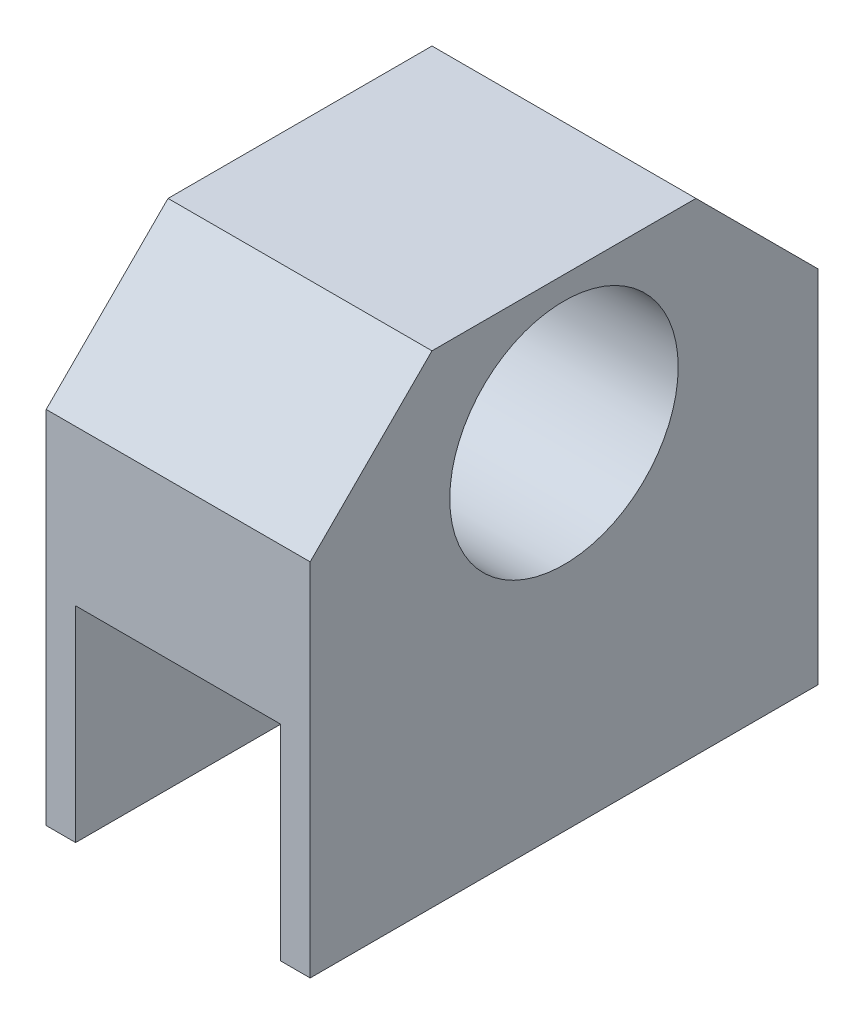
ISO-10303-21;
HEADER;
FILE_DESCRIPTION(('STEP AP214'),'2;1');
FILE_NAME('part.step','',(''),(''),'','','');
FILE_SCHEMA(('AUTOMOTIVE_DESIGN { 1 0 10303 214 1 1 1 1 }'));
ENDSEC;
DATA;
#1=APPLICATION_CONTEXT('core data for automotive mechanical design processes');
#2=APPLICATION_PROTOCOL_DEFINITION('international standard','automotive_design',2000,#1);
#3=PRODUCT_CONTEXT('',#1,'mechanical');
#4=PRODUCT('Part','Part','',(#3));
#5=PRODUCT_RELATED_PRODUCT_CATEGORY('part','',(#4));
#6=PRODUCT_DEFINITION_FORMATION('','',#4);
#7=PRODUCT_DEFINITION_CONTEXT('part definition',#1,'design');
#8=PRODUCT_DEFINITION('design','',#6,#7);
#9=PRODUCT_DEFINITION_SHAPE('','',#8);
#10=(LENGTH_UNIT() NAMED_UNIT(*) SI_UNIT(.MILLI.,.METRE.));
#11=(NAMED_UNIT(*) PLANE_ANGLE_UNIT() SI_UNIT($,.RADIAN.));
#12=(NAMED_UNIT(*) SI_UNIT($,.STERADIAN.) SOLID_ANGLE_UNIT());
#13=UNCERTAINTY_MEASURE_WITH_UNIT(LENGTH_MEASURE(1.E-05),#10,'distance_accuracy_value','');
#14=(GEOMETRIC_REPRESENTATION_CONTEXT(3) GLOBAL_UNCERTAINTY_ASSIGNED_CONTEXT((#13)) GLOBAL_UNIT_ASSIGNED_CONTEXT((#10,
#11,#12)) REPRESENTATION_CONTEXT('',''));
#15=CARTESIAN_POINT('',(0.,0.,0.));
#16=DIRECTION('',(0.,0.,1.));
#17=DIRECTION('',(1.,0.,0.));
#18=AXIS2_PLACEMENT_3D('',#15,#16,#17);
#19=CARTESIAN_POINT('',(13.,-25.,25.));
#20=DIRECTION('',(0.,1.,0.));
#21=DIRECTION('',(0.,0.,1.));
#22=AXIS2_PLACEMENT_3D('',#19,#20,#21);
#23=PLANE('',#22);
#24=DIRECTION('',(-1.,0.,0.));
#25=VECTOR('',#24,1.);
#26=CARTESIAN_POINT('',(13.,-25.,-25.));
#27=LINE('',#26,#25);
#28=CARTESIAN_POINT('',(-10.1,-25.,-25.));
#29=VERTEX_POINT('',#28);
#30=CARTESIAN_POINT('',(-13.,-25.,-25.));
#31=VERTEX_POINT('',#30);
#32=EDGE_CURVE('E93',#29,#31,#27,.T.);
#33=ORIENTED_EDGE('',*,*,#32,.F.);
#34=DIRECTION('',(0.,0.,-1.));
#35=VECTOR('',#34,1.);
#36=CARTESIAN_POINT('',(-10.1,-25.,25.));
#37=LINE('',#36,#35);
#38=CARTESIAN_POINT('',(-10.1,-25.,25.));
#39=VERTEX_POINT('',#38);
#40=EDGE_CURVE('E180',#39,#29,#37,.T.);
#41=ORIENTED_EDGE('',*,*,#40,.F.);
#42=DIRECTION('',(-1.,0.,0.));
#43=VECTOR('',#42,1.);
#44=CARTESIAN_POINT('',(13.,-25.,25.));
#45=LINE('',#44,#43);
#46=CARTESIAN_POINT('',(-13.,-25.,25.));
#47=VERTEX_POINT('',#46);
#48=EDGE_CURVE('E159',#39,#47,#45,.T.);
#49=ORIENTED_EDGE('',*,*,#48,.T.);
#50=DIRECTION('',(0.,0.,-1.));
#51=VECTOR('',#50,1.);
#52=CARTESIAN_POINT('',(-13.,-25.,25.));
#53=LINE('',#52,#51);
#54=EDGE_CURVE('E153',#47,#31,#53,.T.);
#55=ORIENTED_EDGE('',*,*,#54,.T.);
#56=EDGE_LOOP('',(#33,#41,#49,#55));
#57=FACE_BOUND('',#56,.T.);
#58=ADVANCED_FACE('F41',(#57),#23,.F.);
#59=CARTESIAN_POINT('',(13.,0.,0.));
#60=DIRECTION('',(1.,0.,0.));
#61=DIRECTION('',(0.,0.,-1.));
#62=AXIS2_PLACEMENT_3D('',#59,#60,#61);
#63=PLANE('',#62);
#64=DIRECTION('',(0.,1.,0.));
#65=VECTOR('',#64,1.);
#66=CARTESIAN_POINT('',(13.,10.5,-25.));
#67=LINE('',#66,#65);
#68=CARTESIAN_POINT('',(13.,-25.,-25.));
#69=VERTEX_POINT('',#68);
#70=CARTESIAN_POINT('',(13.,10.5,-25.));
#71=VERTEX_POINT('',#70);
#72=EDGE_CURVE('E155',#69,#71,#67,.T.);
#73=ORIENTED_EDGE('',*,*,#72,.T.);
#74=DIRECTION('',(0.,0.707106781186549,0.707106781186546));
#75=VECTOR('',#74,1.);
#76=CARTESIAN_POINT('',(13.,10.5,-25.));
#77=LINE('',#76,#75);
#78=CARTESIAN_POINT('',(13.,22.5,-13.0000000000001));
#79=VERTEX_POINT('',#78);
#80=EDGE_CURVE('E101',#71,#79,#77,.T.);
#81=ORIENTED_EDGE('',*,*,#80,.T.);
#82=DIRECTION('',(0.,0.,1.));
#83=VECTOR('',#82,1.);
#84=CARTESIAN_POINT('',(13.,22.5,13.0000000000001));
#85=LINE('',#84,#83);
#86=CARTESIAN_POINT('',(13.,22.5,13.0000000000001));
#87=VERTEX_POINT('',#86);
#88=EDGE_CURVE('E119',#79,#87,#85,.T.);
#89=ORIENTED_EDGE('',*,*,#88,.T.);
#90=DIRECTION('',(0.,-0.707106781186549,0.707106781186546));
#91=VECTOR('',#90,1.);
#92=CARTESIAN_POINT('',(13.,10.5,25.));
#93=LINE('',#92,#91);
#94=CARTESIAN_POINT('',(13.,10.5,25.));
#95=VERTEX_POINT('',#94);
#96=EDGE_CURVE('E111',#87,#95,#93,.T.);
#97=ORIENTED_EDGE('',*,*,#96,.T.);
#98=DIRECTION('',(0.,-1.,0.));
#99=VECTOR('',#98,1.);
#100=CARTESIAN_POINT('',(13.,10.5,25.));
#101=LINE('',#100,#99);
#102=CARTESIAN_POINT('',(13.,-25.,25.));
#103=VERTEX_POINT('',#102);
#104=EDGE_CURVE('E116',#95,#103,#101,.T.);
#105=ORIENTED_EDGE('',*,*,#104,.T.);
#106=DIRECTION('',(0.,0.,-1.));
#107=VECTOR('',#106,1.);
#108=CARTESIAN_POINT('',(13.,-25.,25.));
#109=LINE('',#108,#107);
#110=EDGE_CURVE('E65',#103,#69,#109,.T.);
#111=ORIENTED_EDGE('',*,*,#110,.T.);
#112=EDGE_LOOP('',(#73,#81,#89,#97,#105,#111));
#113=FACE_BOUND('',#112,.T.);
#114=CARTESIAN_POINT('',(13.,9.,0.));
#115=DIRECTION('',(1.,0.,0.));
#116=DIRECTION('',(0.,0.,-1.));
#117=AXIS2_PLACEMENT_3D('',#114,#115,#116);
#118=CIRCLE('',#117,11.25);
#119=CARTESIAN_POINT('',(13.,9.,11.25));
#120=VERTEX_POINT('',#119);
#121=EDGE_CURVE('E146',#120,#120,#118,.T.);
#122=ORIENTED_EDGE('',*,*,#121,.F.);
#123=EDGE_LOOP('',(#122));
#124=FACE_BOUND('',#123,.T.);
#125=ADVANCED_FACE('F113',(#113,#124),#63,.T.);
#126=CARTESIAN_POINT('',(-13.,0.,0.));
#127=DIRECTION('',(1.,0.,0.));
#128=DIRECTION('',(0.,0.,-1.));
#129=AXIS2_PLACEMENT_3D('',#126,#127,#128);
#130=PLANE('',#129);
#131=DIRECTION('',(0.,1.,0.));
#132=VECTOR('',#131,1.);
#133=CARTESIAN_POINT('',(-13.,10.5,-25.));
#134=LINE('',#133,#132);
#135=CARTESIAN_POINT('',(-13.,10.5,-25.));
#136=VERTEX_POINT('',#135);
#137=EDGE_CURVE('E143',#31,#136,#134,.T.);
#138=ORIENTED_EDGE('',*,*,#137,.F.);
#139=ORIENTED_EDGE('',*,*,#54,.F.);
#140=DIRECTION('',(0.,-1.,0.));
#141=VECTOR('',#140,1.);
#142=CARTESIAN_POINT('',(-13.,10.5,25.));
#143=LINE('',#142,#141);
#144=CARTESIAN_POINT('',(-13.,10.5,25.));
#145=VERTEX_POINT('',#144);
#146=EDGE_CURVE('E151',#145,#47,#143,.T.);
#147=ORIENTED_EDGE('',*,*,#146,.F.);
#148=DIRECTION('',(0.,-0.707106781186549,0.707106781186546));
#149=VECTOR('',#148,1.);
#150=CARTESIAN_POINT('',(-13.,10.5,25.));
#151=LINE('',#150,#149);
#152=CARTESIAN_POINT('',(-13.,22.5,13.0000000000001));
#153=VERTEX_POINT('',#152);
#154=EDGE_CURVE('E128',#153,#145,#151,.T.);
#155=ORIENTED_EDGE('',*,*,#154,.F.);
#156=DIRECTION('',(0.,0.,1.));
#157=VECTOR('',#156,1.);
#158=CARTESIAN_POINT('',(-13.,22.5,13.0000000000001));
#159=LINE('',#158,#157);
#160=CARTESIAN_POINT('',(-13.,22.5,-13.0000000000001));
#161=VERTEX_POINT('',#160);
#162=EDGE_CURVE('E148',#161,#153,#159,.T.);
#163=ORIENTED_EDGE('',*,*,#162,.F.);
#164=DIRECTION('',(0.,0.707106781186549,0.707106781186546));
#165=VECTOR('',#164,1.);
#166=CARTESIAN_POINT('',(-13.,10.5,-25.));
#167=LINE('',#166,#165);
#168=EDGE_CURVE('E145',#136,#161,#167,.T.);
#169=ORIENTED_EDGE('',*,*,#168,.F.);
#170=EDGE_LOOP('',(#138,#139,#147,#155,#163,#169));
#171=FACE_BOUND('',#170,.T.);
#172=CARTESIAN_POINT('',(-13.,9.,0.));
#173=DIRECTION('',(1.,0.,0.));
#174=DIRECTION('',(0.,0.,-1.));
#175=AXIS2_PLACEMENT_3D('',#172,#173,#174);
#176=CIRCLE('',#175,11.25);
#177=CARTESIAN_POINT('',(-13.,9.,11.25));
#178=VERTEX_POINT('',#177);
#179=EDGE_CURVE('E183',#178,#178,#176,.T.);
#180=ORIENTED_EDGE('',*,*,#179,.T.);
#181=EDGE_LOOP('',(#180));
#182=FACE_BOUND('',#181,.T.);
#183=ADVANCED_FACE('F167',(#171,#182),#130,.F.);
#184=CARTESIAN_POINT('',(13.,10.5,-25.));
#185=DIRECTION('',(0.,0.,1.));
#186=DIRECTION('',(0.,-1.,0.));
#187=AXIS2_PLACEMENT_3D('',#184,#185,#186);
#188=PLANE('',#187);
#189=DIRECTION('',(1.,0.,0.));
#190=VECTOR('',#189,1.);
#191=CARTESIAN_POINT('',(10.1,-4.8,-25.));
#192=LINE('',#191,#190);
#193=CARTESIAN_POINT('',(-10.1,-4.8,-25.));
#194=VERTEX_POINT('',#193);
#195=CARTESIAN_POINT('',(10.1,-4.8,-25.));
#196=VERTEX_POINT('',#195);
#197=EDGE_CURVE('E250',#194,#196,#192,.T.);
#198=ORIENTED_EDGE('',*,*,#197,.F.);
#199=DIRECTION('',(0.,1.,0.));
#200=VECTOR('',#199,1.);
#201=CARTESIAN_POINT('',(-10.1,-25.,-25.));
#202=LINE('',#201,#200);
#203=EDGE_CURVE('E242',#29,#194,#202,.T.);
#204=ORIENTED_EDGE('',*,*,#203,.F.);
#205=ORIENTED_EDGE('',*,*,#32,.T.);
#206=ORIENTED_EDGE('',*,*,#137,.T.);
#207=DIRECTION('',(-1.,0.,0.));
#208=VECTOR('',#207,1.);
#209=CARTESIAN_POINT('',(13.,10.5,-25.));
#210=LINE('',#209,#208);
#211=EDGE_CURVE('E11',#71,#136,#210,.T.);
#212=ORIENTED_EDGE('',*,*,#211,.F.);
#213=ORIENTED_EDGE('',*,*,#72,.F.);
#214=CARTESIAN_POINT('',(10.1,-25.,-25.));
#215=VERTEX_POINT('',#214);
#216=EDGE_CURVE('E156',#69,#215,#27,.T.);
#217=ORIENTED_EDGE('',*,*,#216,.T.);
#218=DIRECTION('',(0.,-1.,0.));
#219=VECTOR('',#218,1.);
#220=CARTESIAN_POINT('',(10.1,-25.,-25.));
#221=LINE('',#220,#219);
#222=EDGE_CURVE('E56',#196,#215,#221,.T.);
#223=ORIENTED_EDGE('',*,*,#222,.F.);
#224=EDGE_LOOP('',(#198,#204,#205,#206,#212,#213,#217,#223));
#225=FACE_BOUND('',#224,.T.);
#226=ADVANCED_FACE('F43',(#225),#188,.F.);
#227=CARTESIAN_POINT('',(13.,10.5,-25.));
#228=DIRECTION('',(0.,-0.707106781186546,0.707106781186549));
#229=DIRECTION('',(0.,-0.707106781186549,-0.707106781186546));
#230=AXIS2_PLACEMENT_3D('',#227,#228,#229);
#231=PLANE('',#230);
#232=ORIENTED_EDGE('',*,*,#168,.T.);
#233=DIRECTION('',(-1.,0.,0.));
#234=VECTOR('',#233,1.);
#235=CARTESIAN_POINT('',(13.,22.5,-13.0000000000001));
#236=LINE('',#235,#234);
#237=EDGE_CURVE('E49',#79,#161,#236,.T.);
#238=ORIENTED_EDGE('',*,*,#237,.F.);
#239=ORIENTED_EDGE('',*,*,#80,.F.);
#240=ORIENTED_EDGE('',*,*,#211,.T.);
#241=EDGE_LOOP('',(#232,#238,#239,#240));
#242=FACE_BOUND('',#241,.T.);
#243=ADVANCED_FACE('F204',(#242),#231,.F.);
#244=CARTESIAN_POINT('',(13.,22.5,13.0000000000001));
#245=DIRECTION('',(0.,-1.,0.));
#246=DIRECTION('',(0.,0.,-1.));
#247=AXIS2_PLACEMENT_3D('',#244,#245,#246);
#248=PLANE('',#247);
#249=ORIENTED_EDGE('',*,*,#162,.T.);
#250=DIRECTION('',(-1.,0.,0.));
#251=VECTOR('',#250,1.);
#252=CARTESIAN_POINT('',(13.,22.5,13.0000000000001));
#253=LINE('',#252,#251);
#254=EDGE_CURVE('E132',#87,#153,#253,.T.);
#255=ORIENTED_EDGE('',*,*,#254,.F.);
#256=ORIENTED_EDGE('',*,*,#88,.F.);
#257=ORIENTED_EDGE('',*,*,#237,.T.);
#258=EDGE_LOOP('',(#249,#255,#256,#257));
#259=FACE_BOUND('',#258,.T.);
#260=ADVANCED_FACE('F164',(#259),#248,.F.);
#261=CARTESIAN_POINT('',(13.,10.5,25.));
#262=DIRECTION('',(0.,-0.707106781186546,-0.707106781186549));
#263=DIRECTION('',(0.,0.707106781186549,-0.707106781186546));
#264=AXIS2_PLACEMENT_3D('',#261,#262,#263);
#265=PLANE('',#264);
#266=ORIENTED_EDGE('',*,*,#154,.T.);
#267=DIRECTION('',(-1.,0.,0.));
#268=VECTOR('',#267,1.);
#269=CARTESIAN_POINT('',(13.,10.5,25.));
#270=LINE('',#269,#268);
#271=EDGE_CURVE('E125',#95,#145,#270,.T.);
#272=ORIENTED_EDGE('',*,*,#271,.F.);
#273=ORIENTED_EDGE('',*,*,#96,.F.);
#274=ORIENTED_EDGE('',*,*,#254,.T.);
#275=EDGE_LOOP('',(#266,#272,#273,#274));
#276=FACE_BOUND('',#275,.T.);
#277=ADVANCED_FACE('F126',(#276),#265,.F.);
#278=CARTESIAN_POINT('',(13.,10.5,25.));
#279=DIRECTION('',(0.,0.,-1.));
#280=DIRECTION('',(0.,1.,0.));
#281=AXIS2_PLACEMENT_3D('',#278,#279,#280);
#282=PLANE('',#281);
#283=ORIENTED_EDGE('',*,*,#48,.F.);
#284=DIRECTION('',(0.,1.,0.));
#285=VECTOR('',#284,1.);
#286=CARTESIAN_POINT('',(-10.1,-25.,25.));
#287=LINE('',#286,#285);
#288=CARTESIAN_POINT('',(-10.1,-4.79999999999999,25.));
#289=VERTEX_POINT('',#288);
#290=EDGE_CURVE('E174',#39,#289,#287,.T.);
#291=ORIENTED_EDGE('',*,*,#290,.T.);
#292=DIRECTION('',(1.,0.,0.));
#293=VECTOR('',#292,1.);
#294=CARTESIAN_POINT('',(10.1,-4.79999999999999,25.));
#295=LINE('',#294,#293);
#296=CARTESIAN_POINT('',(10.1,-4.79999999999999,25.));
#297=VERTEX_POINT('',#296);
#298=EDGE_CURVE('E244',#289,#297,#295,.T.);
#299=ORIENTED_EDGE('',*,*,#298,.T.);
#300=DIRECTION('',(0.,-1.,0.));
#301=VECTOR('',#300,1.);
#302=CARTESIAN_POINT('',(10.1,-25.,25.));
#303=LINE('',#302,#301);
#304=CARTESIAN_POINT('',(10.1,-25.,25.));
#305=VERTEX_POINT('',#304);
#306=EDGE_CURVE('E197',#297,#305,#303,.T.);
#307=ORIENTED_EDGE('',*,*,#306,.T.);
#308=EDGE_CURVE('E133',#103,#305,#45,.T.);
#309=ORIENTED_EDGE('',*,*,#308,.F.);
#310=ORIENTED_EDGE('',*,*,#104,.F.);
#311=ORIENTED_EDGE('',*,*,#271,.T.);
#312=ORIENTED_EDGE('',*,*,#146,.T.);
#313=EDGE_LOOP('',(#283,#291,#299,#307,#309,#310,#311,#312));
#314=FACE_BOUND('',#313,.T.);
#315=ADVANCED_FACE('F136',(#314),#282,.F.);
#316=ORIENTED_EDGE('',*,*,#308,.T.);
#317=DIRECTION('',(0.,0.,-1.));
#318=VECTOR('',#317,1.);
#319=CARTESIAN_POINT('',(10.1,-25.,25.));
#320=LINE('',#319,#318);
#321=EDGE_CURVE('E184',#305,#215,#320,.T.);
#322=ORIENTED_EDGE('',*,*,#321,.T.);
#323=ORIENTED_EDGE('',*,*,#216,.F.);
#324=ORIENTED_EDGE('',*,*,#110,.F.);
#325=EDGE_LOOP('',(#316,#322,#323,#324));
#326=FACE_BOUND('',#325,.T.);
#327=ADVANCED_FACE('F213',(#326),#23,.F.);
#328=CARTESIAN_POINT('',(13.,9.,0.));
#329=DIRECTION('',(-1.,0.,0.));
#330=DIRECTION('',(0.,0.,1.));
#331=AXIS2_PLACEMENT_3D('',#328,#329,#330);
#332=CYLINDRICAL_SURFACE('',#331,11.25);
#333=CARTESIAN_POINT('',(13.,9.,11.25));
#334=CARTESIAN_POINT('',(12.7291666666667,9.,11.25));
#335=CARTESIAN_POINT('',(12.4583333333333,9.,11.25));
#336=CARTESIAN_POINT('',(11.9166666666667,9.,11.25));
#337=CARTESIAN_POINT('',(11.6458333333333,9.,11.25));
#338=CARTESIAN_POINT('',(11.1041666666667,9.,11.25));
#339=CARTESIAN_POINT('',(10.8333333333333,9.,11.25));
#340=CARTESIAN_POINT('',(10.2916666666667,9.,11.25));
#341=CARTESIAN_POINT('',(10.0208333333333,9.,11.25));
#342=CARTESIAN_POINT('',(9.47916666666667,9.,11.25));
#343=CARTESIAN_POINT('',(9.20833333333333,9.,11.25));
#344=CARTESIAN_POINT('',(8.66666666666667,9.,11.25));
#345=CARTESIAN_POINT('',(8.39583333333333,9.,11.25));
#346=CARTESIAN_POINT('',(7.85416666666667,9.,11.25));
#347=CARTESIAN_POINT('',(7.58333333333333,9.,11.25));
#348=CARTESIAN_POINT('',(7.04166666666667,9.,11.25));
#349=CARTESIAN_POINT('',(6.77083333333333,9.,11.25));
#350=CARTESIAN_POINT('',(6.22916666666667,9.,11.25));
#351=CARTESIAN_POINT('',(5.95833333333333,9.,11.25));
#352=CARTESIAN_POINT('',(5.41666666666667,9.,11.25));
#353=CARTESIAN_POINT('',(5.14583333333333,9.,11.25));
#354=CARTESIAN_POINT('',(4.60416666666667,9.,11.25));
#355=CARTESIAN_POINT('',(4.33333333333333,9.,11.25));
#356=CARTESIAN_POINT('',(3.79166666666667,9.,11.25));
#357=CARTESIAN_POINT('',(3.52083333333333,9.,11.25));
#358=CARTESIAN_POINT('',(2.97916666666666,9.,11.25));
#359=CARTESIAN_POINT('',(2.70833333333333,9.,11.25));
#360=CARTESIAN_POINT('',(2.16666666666667,9.,11.25));
#361=CARTESIAN_POINT('',(1.89583333333333,9.,11.25));
#362=CARTESIAN_POINT('',(1.35416666666666,9.,11.25));
#363=CARTESIAN_POINT('',(1.08333333333333,9.,11.25));
#364=CARTESIAN_POINT('',(0.541666666666665,9.,11.25));
#365=CARTESIAN_POINT('',(0.270833333333332,9.,11.25));
#366=CARTESIAN_POINT('',(-0.270833333333335,9.,11.25));
#367=CARTESIAN_POINT('',(-0.541666666666669,9.,11.25));
#368=CARTESIAN_POINT('',(-1.08333333333334,9.,11.25));
#369=CARTESIAN_POINT('',(-1.35416666666667,9.,11.25));
#370=CARTESIAN_POINT('',(-1.89583333333333,9.,11.25));
#371=CARTESIAN_POINT('',(-2.16666666666667,9.,11.25));
#372=CARTESIAN_POINT('',(-2.70833333333333,9.,11.25));
#373=CARTESIAN_POINT('',(-2.97916666666667,9.,11.25));
#374=CARTESIAN_POINT('',(-3.52083333333333,9.,11.25));
#375=CARTESIAN_POINT('',(-3.79166666666667,9.,11.25));
#376=CARTESIAN_POINT('',(-4.33333333333333,9.,11.25));
#377=CARTESIAN_POINT('',(-4.60416666666667,9.,11.25));
#378=CARTESIAN_POINT('',(-5.14583333333333,9.,11.25));
#379=CARTESIAN_POINT('',(-5.41666666666667,9.,11.25));
#380=CARTESIAN_POINT('',(-5.95833333333333,9.,11.25));
#381=CARTESIAN_POINT('',(-6.22916666666667,9.,11.25));
#382=CARTESIAN_POINT('',(-6.77083333333333,9.,11.25));
#383=CARTESIAN_POINT('',(-7.04166666666667,9.,11.25));
#384=CARTESIAN_POINT('',(-7.58333333333333,9.,11.25));
#385=CARTESIAN_POINT('',(-7.85416666666667,9.,11.25));
#386=CARTESIAN_POINT('',(-8.39583333333333,9.,11.25));
#387=CARTESIAN_POINT('',(-8.66666666666667,9.,11.25));
#388=CARTESIAN_POINT('',(-9.20833333333333,9.,11.25));
#389=CARTESIAN_POINT('',(-9.47916666666667,9.,11.25));
#390=CARTESIAN_POINT('',(-10.0208333333333,9.,11.25));
#391=CARTESIAN_POINT('',(-10.2916666666667,9.,11.25));
#392=CARTESIAN_POINT('',(-10.8333333333333,9.,11.25));
#393=CARTESIAN_POINT('',(-11.1041666666667,9.,11.25));
#394=CARTESIAN_POINT('',(-11.6458333333333,9.,11.25));
#395=CARTESIAN_POINT('',(-11.9166666666667,9.,11.25));
#396=CARTESIAN_POINT('',(-12.4583333333333,9.,11.25));
#397=CARTESIAN_POINT('',(-12.7291666666667,9.,11.25));
#398=CARTESIAN_POINT('',(-13.,9.,11.25));
#399=B_SPLINE_CURVE_WITH_KNOTS('',3,(#333,#334,#335,#336,#337,#338,#339,#340,#341,#342,#343,
#344,#345,#346,#347,#348,#349,#350,#351,#352,#353,#354,#355,#356,#357,#358,#359,#360,#361,#362,
#363,#364,#365,#366,#367,#368,#369,#370,#371,#372,#373,#374,#375,#376,#377,#378,#379,#380,#381,
#382,#383,#384,#385,#386,#387,#388,#389,#390,#391,#392,#393,#394,#395,#396,#397,#398),
.UNSPECIFIED.,.F.,.F.,(4,2,2,2,2,2,2,2,2,2,2,2,2,2,2,2,2,2,2,2,2,2,2,2,2,2,2,2,2,2,2,2,4),(0.,
0.812499999999999,1.625,2.4375,3.25,4.0625,4.875,5.6875,6.5,7.3125,8.125,8.9375,9.75,10.5625,
11.375,12.1875,13.,13.8125,14.625,15.4375,16.25,17.0625,17.875,18.6875,19.5,20.3125,21.125,
21.9375,22.75,23.5625,24.375,25.1875,26.),.UNSPECIFIED.);
#400=EDGE_CURVE('BSEAM221',#120,#178,#399,.T.);
#401=ORIENTED_EDGE('',*,*,#121,.T.);
#402=ORIENTED_EDGE('',*,*,#179,.F.);
#403=ORIENTED_EDGE('',*,*,#400,.T.);
#404=ORIENTED_EDGE('',*,*,#400,.F.);
#405=EDGE_LOOP('',(#401,#403,#402,#404));
#406=FACE_BOUND('',#405,.T.);
#407=ADVANCED_FACE('F221',(#406),#332,.F.);
#408=CARTESIAN_POINT('',(-10.1,-25.,25.));
#409=DIRECTION('',(-1.,0.,0.));
#410=DIRECTION('',(0.,-1.,0.));
#411=AXIS2_PLACEMENT_3D('',#408,#409,#410);
#412=PLANE('',#411);
#413=ORIENTED_EDGE('',*,*,#203,.T.);
#414=DIRECTION('',(0.,0.,-1.));
#415=VECTOR('',#414,1.);
#416=CARTESIAN_POINT('',(-10.1,-4.79999999999999,25.));
#417=LINE('',#416,#415);
#418=EDGE_CURVE('E194',#289,#194,#417,.T.);
#419=ORIENTED_EDGE('',*,*,#418,.F.);
#420=ORIENTED_EDGE('',*,*,#290,.F.);
#421=ORIENTED_EDGE('',*,*,#40,.T.);
#422=EDGE_LOOP('',(#413,#419,#420,#421));
#423=FACE_BOUND('',#422,.T.);
#424=ADVANCED_FACE('F227',(#423),#412,.F.);
#425=CARTESIAN_POINT('',(10.1,-25.,25.));
#426=DIRECTION('',(1.,0.,0.));
#427=DIRECTION('',(0.,1.,0.));
#428=AXIS2_PLACEMENT_3D('',#425,#426,#427);
#429=PLANE('',#428);
#430=ORIENTED_EDGE('',*,*,#222,.T.);
#431=ORIENTED_EDGE('',*,*,#321,.F.);
#432=ORIENTED_EDGE('',*,*,#306,.F.);
#433=DIRECTION('',(0.,0.,-1.));
#434=VECTOR('',#433,1.);
#435=CARTESIAN_POINT('',(10.1,-4.79999999999999,25.));
#436=LINE('',#435,#434);
#437=EDGE_CURVE('E188',#297,#196,#436,.T.);
#438=ORIENTED_EDGE('',*,*,#437,.T.);
#439=EDGE_LOOP('',(#430,#431,#432,#438));
#440=FACE_BOUND('',#439,.T.);
#441=ADVANCED_FACE('F251',(#440),#429,.F.);
#442=CARTESIAN_POINT('',(10.1,-4.79999999999999,25.));
#443=DIRECTION('',(0.,1.,0.));
#444=DIRECTION('',(0.,0.,1.));
#445=AXIS2_PLACEMENT_3D('',#442,#443,#444);
#446=PLANE('',#445);
#447=ORIENTED_EDGE('',*,*,#197,.T.);
#448=ORIENTED_EDGE('',*,*,#437,.F.);
#449=ORIENTED_EDGE('',*,*,#298,.F.);
#450=ORIENTED_EDGE('',*,*,#418,.T.);
#451=EDGE_LOOP('',(#447,#448,#449,#450));
#452=FACE_BOUND('',#451,.T.);
#453=ADVANCED_FACE('F245',(#452),#446,.F.);
#454=CLOSED_SHELL('',(#58,#125,#183,#226,#243,#260,#277,#315,#327,#407,#424,#441,#453));
#455=MANIFOLD_SOLID_BREP('B2',#454);
#456=ADVANCED_BREP_SHAPE_REPRESENTATION('',(#18,#455),#14);
#457=SHAPE_DEFINITION_REPRESENTATION(#9,#456);
ENDSEC;
END-ISO-10303-21;
